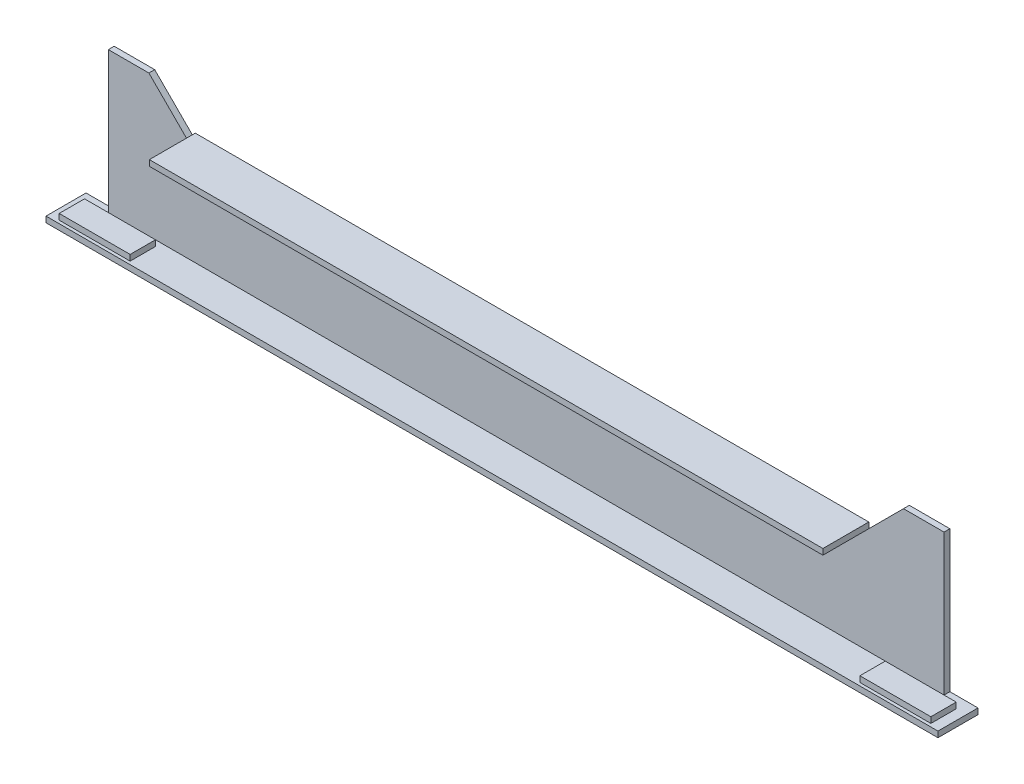
ISO-10303-21;
HEADER;
FILE_DESCRIPTION(('STEP AP214'),'2;1');
FILE_NAME('part.step','',(''),(''),'','','');
FILE_SCHEMA(('AUTOMOTIVE_DESIGN { 1 0 10303 214 1 1 1 1 }'));
ENDSEC;
DATA;
#1=APPLICATION_CONTEXT('core data for automotive mechanical design processes');
#2=APPLICATION_PROTOCOL_DEFINITION('international standard','automotive_design',2000,#1);
#3=PRODUCT_CONTEXT('',#1,'mechanical');
#4=PRODUCT('Part','Part','',(#3));
#5=PRODUCT_RELATED_PRODUCT_CATEGORY('part','',(#4));
#6=PRODUCT_DEFINITION_FORMATION('','',#4);
#7=PRODUCT_DEFINITION_CONTEXT('part definition',#1,'design');
#8=PRODUCT_DEFINITION('design','',#6,#7);
#9=PRODUCT_DEFINITION_SHAPE('','',#8);
#10=(LENGTH_UNIT() NAMED_UNIT(*) SI_UNIT(.MILLI.,.METRE.));
#11=(NAMED_UNIT(*) PLANE_ANGLE_UNIT() SI_UNIT($,.RADIAN.));
#12=(NAMED_UNIT(*) SI_UNIT($,.STERADIAN.) SOLID_ANGLE_UNIT());
#13=UNCERTAINTY_MEASURE_WITH_UNIT(LENGTH_MEASURE(1.E-05),#10,'distance_accuracy_value','');
#14=(GEOMETRIC_REPRESENTATION_CONTEXT(3) GLOBAL_UNCERTAINTY_ASSIGNED_CONTEXT((#13)) GLOBAL_UNIT_ASSIGNED_CONTEXT((#10,
#11,#12)) REPRESENTATION_CONTEXT('',''));
#15=CARTESIAN_POINT('',(0.,0.,0.));
#16=DIRECTION('',(0.,0.,1.));
#17=DIRECTION('',(1.,0.,0.));
#18=AXIS2_PLACEMENT_3D('',#15,#16,#17);
#19=CARTESIAN_POINT('',(880.,-139.25,79.));
#20=DIRECTION('',(0.,-1.,0.));
#21=DIRECTION('',(1.,0.,0.));
#22=AXIS2_PLACEMENT_3D('',#19,#20,#21);
#23=PLANE('',#22);
#24=DIRECTION('',(0.,0.,1.));
#25=VECTOR('',#24,1.);
#26=CARTESIAN_POINT('',(720.,-139.25,23.));
#27=LINE('',#26,#25);
#28=CARTESIAN_POINT('',(720.,-139.25,23.));
#29=VERTEX_POINT('',#28);
#30=CARTESIAN_POINT('',(720.,-139.25,73.));
#31=VERTEX_POINT('',#30);
#32=EDGE_CURVE('E212',#29,#31,#27,.T.);
#33=ORIENTED_EDGE('',*,*,#32,.F.);
#34=DIRECTION('',(-1.,0.,0.));
#35=VECTOR('',#34,1.);
#36=CARTESIAN_POINT('',(720.,-139.25,23.));
#37=LINE('',#36,#35);
#38=CARTESIAN_POINT('',(860.,-139.25,23.));
#39=VERTEX_POINT('',#38);
#40=EDGE_CURVE('E225',#39,#29,#37,.T.);
#41=ORIENTED_EDGE('',*,*,#40,.F.);
#42=DIRECTION('',(0.,0.,-1.));
#43=VECTOR('',#42,1.);
#44=CARTESIAN_POINT('',(860.,-139.25,23.));
#45=LINE('',#44,#43);
#46=CARTESIAN_POINT('',(860.,-139.25,73.));
#47=VERTEX_POINT('',#46);
#48=EDGE_CURVE('E234',#47,#39,#45,.T.);
#49=ORIENTED_EDGE('',*,*,#48,.F.);
#50=DIRECTION('',(1.,0.,0.));
#51=VECTOR('',#50,1.);
#52=CARTESIAN_POINT('',(720.,-139.25,73.));
#53=LINE('',#52,#51);
#54=EDGE_CURVE('E215',#31,#47,#53,.T.);
#55=ORIENTED_EDGE('',*,*,#54,.F.);
#56=EDGE_LOOP('',(#33,#41,#49,#55));
#57=FACE_BOUND('',#56,.T.);
#58=DIRECTION('',(0.,0.,-1.));
#59=VECTOR('',#58,1.);
#60=CARTESIAN_POINT('',(824.5,-139.25,11.5));
#61=LINE('',#60,#59);
#62=CARTESIAN_POINT('',(824.5,-139.25,11.5));
#63=VERTEX_POINT('',#62);
#64=CARTESIAN_POINT('',(824.5,-139.25,0.));
#65=VERTEX_POINT('',#64);
#66=EDGE_CURVE('E43',#63,#65,#61,.T.);
#67=ORIENTED_EDGE('',*,*,#66,.F.);
#68=DIRECTION('',(1.,0.,0.));
#69=VECTOR('',#68,1.);
#70=CARTESIAN_POINT('',(-824.5,-139.25,11.5));
#71=LINE('',#70,#69);
#72=CARTESIAN_POINT('',(-824.5,-139.25,11.5));
#73=VERTEX_POINT('',#72);
#74=EDGE_CURVE('E376',#73,#63,#71,.T.);
#75=ORIENTED_EDGE('',*,*,#74,.F.);
#76=DIRECTION('',(0.,0.,-1.));
#77=VECTOR('',#76,1.);
#78=CARTESIAN_POINT('',(-824.5,-139.25,11.5));
#79=LINE('',#78,#77);
#80=CARTESIAN_POINT('',(-824.5,-139.25,0.));
#81=VERTEX_POINT('',#80);
#82=EDGE_CURVE('E11',#73,#81,#79,.T.);
#83=ORIENTED_EDGE('',*,*,#82,.T.);
#84=DIRECTION('',(-1.,0.,0.));
#85=VECTOR('',#84,1.);
#86=CARTESIAN_POINT('',(880.,-139.25,0.));
#87=LINE('',#86,#85);
#88=CARTESIAN_POINT('',(-880.,-139.25,0.));
#89=VERTEX_POINT('',#88);
#90=EDGE_CURVE('E253',#81,#89,#87,.T.);
#91=ORIENTED_EDGE('',*,*,#90,.T.);
#92=DIRECTION('',(0.,0.,-1.));
#93=VECTOR('',#92,1.);
#94=CARTESIAN_POINT('',(-880.,-139.25,79.));
#95=LINE('',#94,#93);
#96=CARTESIAN_POINT('',(-880.,-139.25,79.));
#97=VERTEX_POINT('',#96);
#98=EDGE_CURVE('E268',#97,#89,#95,.T.);
#99=ORIENTED_EDGE('',*,*,#98,.F.);
#100=DIRECTION('',(-1.,0.,0.));
#101=VECTOR('',#100,1.);
#102=CARTESIAN_POINT('',(880.,-139.25,79.));
#103=LINE('',#102,#101);
#104=CARTESIAN_POINT('',(880.,-139.25,79.));
#105=VERTEX_POINT('',#104);
#106=EDGE_CURVE('E279',#105,#97,#103,.T.);
#107=ORIENTED_EDGE('',*,*,#106,.F.);
#108=DIRECTION('',(0.,0.,-1.));
#109=VECTOR('',#108,1.);
#110=CARTESIAN_POINT('',(880.,-139.25,79.));
#111=LINE('',#110,#109);
#112=CARTESIAN_POINT('',(880.,-139.25,0.));
#113=VERTEX_POINT('',#112);
#114=EDGE_CURVE('E265',#105,#113,#111,.T.);
#115=ORIENTED_EDGE('',*,*,#114,.T.);
#116=EDGE_CURVE('E262',#113,#65,#87,.T.);
#117=ORIENTED_EDGE('',*,*,#116,.T.);
#118=EDGE_LOOP('',(#67,#75,#83,#91,#99,#107,#115,#117));
#119=FACE_BOUND('',#118,.T.);
#120=DIRECTION('',(0.,0.,-1.));
#121=VECTOR('',#120,1.);
#122=CARTESIAN_POINT('',(-720.,-139.25,23.));
#123=LINE('',#122,#121);
#124=CARTESIAN_POINT('',(-720.,-139.25,73.));
#125=VERTEX_POINT('',#124);
#126=CARTESIAN_POINT('',(-720.,-139.25,23.));
#127=VERTEX_POINT('',#126);
#128=EDGE_CURVE('E211',#125,#127,#123,.T.);
#129=ORIENTED_EDGE('',*,*,#128,.F.);
#130=DIRECTION('',(1.,0.,0.));
#131=VECTOR('',#130,1.);
#132=CARTESIAN_POINT('',(-720.,-139.25,73.));
#133=LINE('',#132,#131);
#134=CARTESIAN_POINT('',(-860.,-139.25,73.));
#135=VERTEX_POINT('',#134);
#136=EDGE_CURVE('E208',#135,#125,#133,.T.);
#137=ORIENTED_EDGE('',*,*,#136,.F.);
#138=DIRECTION('',(0.,0.,1.));
#139=VECTOR('',#138,1.);
#140=CARTESIAN_POINT('',(-860.,-139.25,23.));
#141=LINE('',#140,#139);
#142=CARTESIAN_POINT('',(-860.,-139.25,23.));
#143=VERTEX_POINT('',#142);
#144=EDGE_CURVE('E56',#143,#135,#141,.T.);
#145=ORIENTED_EDGE('',*,*,#144,.F.);
#146=DIRECTION('',(-1.,0.,0.));
#147=VECTOR('',#146,1.);
#148=CARTESIAN_POINT('',(-720.,-139.25,23.));
#149=LINE('',#148,#147);
#150=EDGE_CURVE('E51',#127,#143,#149,.T.);
#151=ORIENTED_EDGE('',*,*,#150,.F.);
#152=EDGE_LOOP('',(#129,#137,#145,#151));
#153=FACE_BOUND('',#152,.T.);
#154=ADVANCED_FACE('F34',(#57,#119,#153),#23,.F.);
#155=CARTESIAN_POINT('',(-824.5,139.25,11.5));
#156=DIRECTION('',(1.,0.,0.));
#157=DIRECTION('',(0.,0.,-1.));
#158=AXIS2_PLACEMENT_3D('',#155,#156,#157);
#159=PLANE('',#158);
#160=DIRECTION('',(0.,-1.,0.));
#161=VECTOR('',#160,1.);
#162=CARTESIAN_POINT('',(-824.5,139.25,0.));
#163=LINE('',#162,#161);
#164=CARTESIAN_POINT('',(-824.5,139.25,0.));
#165=VERTEX_POINT('',#164);
#166=EDGE_CURVE('E315',#165,#81,#163,.T.);
#167=ORIENTED_EDGE('',*,*,#166,.T.);
#168=ORIENTED_EDGE('',*,*,#82,.F.);
#169=DIRECTION('',(0.,-1.,0.));
#170=VECTOR('',#169,1.);
#171=CARTESIAN_POINT('',(-824.5,139.25,11.5));
#172=LINE('',#171,#170);
#173=CARTESIAN_POINT('',(-824.5,139.25,11.5));
#174=VERTEX_POINT('',#173);
#175=EDGE_CURVE('E359',#174,#73,#172,.T.);
#176=ORIENTED_EDGE('',*,*,#175,.F.);
#177=DIRECTION('',(0.,0.,-1.));
#178=VECTOR('',#177,1.);
#179=CARTESIAN_POINT('',(-824.5,139.25,11.5));
#180=LINE('',#179,#178);
#181=EDGE_CURVE('E355',#174,#165,#180,.T.);
#182=ORIENTED_EDGE('',*,*,#181,.T.);
#183=EDGE_LOOP('',(#167,#168,#176,#182));
#184=FACE_BOUND('',#183,.T.);
#185=ADVANCED_FACE('F36',(#184),#159,.F.);
#186=CARTESIAN_POINT('',(824.5,139.25,11.5));
#187=DIRECTION('',(-1.,0.,0.));
#188=DIRECTION('',(0.,0.,1.));
#189=AXIS2_PLACEMENT_3D('',#186,#187,#188);
#190=PLANE('',#189);
#191=DIRECTION('',(0.,1.,0.));
#192=VECTOR('',#191,1.);
#193=CARTESIAN_POINT('',(824.5,139.25,0.));
#194=LINE('',#193,#192);
#195=CARTESIAN_POINT('',(824.5,139.25,0.));
#196=VERTEX_POINT('',#195);
#197=EDGE_CURVE('E319',#65,#196,#194,.T.);
#198=ORIENTED_EDGE('',*,*,#197,.T.);
#199=DIRECTION('',(0.,0.,-1.));
#200=VECTOR('',#199,1.);
#201=CARTESIAN_POINT('',(824.5,139.25,11.5));
#202=LINE('',#201,#200);
#203=CARTESIAN_POINT('',(824.5,139.25,11.5));
#204=VERTEX_POINT('',#203);
#205=EDGE_CURVE('E333',#204,#196,#202,.T.);
#206=ORIENTED_EDGE('',*,*,#205,.F.);
#207=DIRECTION('',(0.,1.,0.));
#208=VECTOR('',#207,1.);
#209=CARTESIAN_POINT('',(824.5,139.25,11.5));
#210=LINE('',#209,#208);
#211=EDGE_CURVE('E374',#63,#204,#210,.T.);
#212=ORIENTED_EDGE('',*,*,#211,.F.);
#213=ORIENTED_EDGE('',*,*,#66,.T.);
#214=EDGE_LOOP('',(#198,#206,#212,#213));
#215=FACE_BOUND('',#214,.T.);
#216=ADVANCED_FACE('F426',(#215),#190,.F.);
#217=CARTESIAN_POINT('',(744.5,139.25,11.5));
#218=DIRECTION('',(0.,-1.,0.));
#219=DIRECTION('',(1.,0.,0.));
#220=AXIS2_PLACEMENT_3D('',#217,#218,#219);
#221=PLANE('',#220);
#222=DIRECTION('',(-1.,0.,0.));
#223=VECTOR('',#222,1.);
#224=CARTESIAN_POINT('',(744.5,139.25,0.));
#225=LINE('',#224,#223);
#226=CARTESIAN_POINT('',(744.5,139.25,0.));
#227=VERTEX_POINT('',#226);
#228=EDGE_CURVE('E322',#196,#227,#225,.T.);
#229=ORIENTED_EDGE('',*,*,#228,.T.);
#230=DIRECTION('',(0.,0.,-1.));
#231=VECTOR('',#230,1.);
#232=CARTESIAN_POINT('',(744.5,139.25,11.5));
#233=LINE('',#232,#231);
#234=CARTESIAN_POINT('',(744.5,139.25,11.5));
#235=VERTEX_POINT('',#234);
#236=EDGE_CURVE('E338',#235,#227,#233,.T.);
#237=ORIENTED_EDGE('',*,*,#236,.F.);
#238=DIRECTION('',(-1.,0.,0.));
#239=VECTOR('',#238,1.);
#240=CARTESIAN_POINT('',(744.5,139.25,11.5));
#241=LINE('',#240,#239);
#242=EDGE_CURVE('E372',#204,#235,#241,.T.);
#243=ORIENTED_EDGE('',*,*,#242,.F.);
#244=ORIENTED_EDGE('',*,*,#205,.T.);
#245=EDGE_LOOP('',(#229,#237,#243,#244));
#246=FACE_BOUND('',#245,.T.);
#247=ADVANCED_FACE('F423',(#246),#221,.F.);
#248=CARTESIAN_POINT('',(744.5,139.25,11.5));
#249=DIRECTION('',(0.707106781186549,-0.707106781186546,0.));
#250=DIRECTION('',(0.707106781186546,0.707106781186549,0.));
#251=AXIS2_PLACEMENT_3D('',#248,#249,#250);
#252=PLANE('',#251);
#253=DIRECTION('',(-0.707106781186546,-0.707106781186549,0.));
#254=VECTOR('',#253,1.);
#255=CARTESIAN_POINT('',(744.5,139.25,0.));
#256=LINE('',#255,#254);
#257=CARTESIAN_POINT('',(664.5,59.2499999999996,0.));
#258=VERTEX_POINT('',#257);
#259=EDGE_CURVE('E362',#227,#258,#256,.T.);
#260=ORIENTED_EDGE('',*,*,#259,.T.);
#261=DIRECTION('',(0.,0.,-1.));
#262=VECTOR('',#261,1.);
#263=CARTESIAN_POINT('',(664.5,59.2499999999996,11.5));
#264=LINE('',#263,#262);
#265=CARTESIAN_POINT('',(664.5,59.2499999999996,11.5));
#266=VERTEX_POINT('',#265);
#267=EDGE_CURVE('E344',#266,#258,#264,.T.);
#268=ORIENTED_EDGE('',*,*,#267,.F.);
#269=DIRECTION('',(-0.707106781186546,-0.707106781186549,0.));
#270=VECTOR('',#269,1.);
#271=CARTESIAN_POINT('',(744.5,139.25,11.5));
#272=LINE('',#271,#270);
#273=EDGE_CURVE('E370',#235,#266,#272,.T.);
#274=ORIENTED_EDGE('',*,*,#273,.F.);
#275=ORIENTED_EDGE('',*,*,#236,.T.);
#276=EDGE_LOOP('',(#260,#268,#274,#275));
#277=FACE_BOUND('',#276,.T.);
#278=ADVANCED_FACE('F419',(#277),#252,.F.);
#279=CARTESIAN_POINT('',(-744.5,139.25,11.5));
#280=DIRECTION('',(-0.707106781186548,-0.707106781186547,0.));
#281=DIRECTION('',(0.707106781186547,-0.707106781186548,0.));
#282=AXIS2_PLACEMENT_3D('',#279,#280,#281);
#283=PLANE('',#282);
#284=DIRECTION('',(-0.707106781186547,0.707106781186548,0.));
#285=VECTOR('',#284,1.);
#286=CARTESIAN_POINT('',(-744.5,139.25,0.));
#287=LINE('',#286,#285);
#288=CARTESIAN_POINT('',(-664.5,59.2499999999996,0.));
#289=VERTEX_POINT('',#288);
#290=CARTESIAN_POINT('',(-744.5,139.25,0.));
#291=VERTEX_POINT('',#290);
#292=EDGE_CURVE('E360',#289,#291,#287,.T.);
#293=ORIENTED_EDGE('',*,*,#292,.T.);
#294=DIRECTION('',(0.,0.,-1.));
#295=VECTOR('',#294,1.);
#296=CARTESIAN_POINT('',(-744.5,139.25,11.5));
#297=LINE('',#296,#295);
#298=CARTESIAN_POINT('',(-744.5,139.25,11.5));
#299=VERTEX_POINT('',#298);
#300=EDGE_CURVE('E352',#299,#291,#297,.T.);
#301=ORIENTED_EDGE('',*,*,#300,.F.);
#302=DIRECTION('',(-0.707106781186547,0.707106781186548,0.));
#303=VECTOR('',#302,1.);
#304=CARTESIAN_POINT('',(-744.5,139.25,11.5));
#305=LINE('',#304,#303);
#306=CARTESIAN_POINT('',(-664.5,59.2499999999996,11.5));
#307=VERTEX_POINT('',#306);
#308=EDGE_CURVE('E366',#307,#299,#305,.T.);
#309=ORIENTED_EDGE('',*,*,#308,.F.);
#310=DIRECTION('',(0.,0.,-1.));
#311=VECTOR('',#310,1.);
#312=CARTESIAN_POINT('',(-664.5,59.2499999999996,11.5));
#313=LINE('',#312,#311);
#314=EDGE_CURVE('E349',#307,#289,#313,.T.);
#315=ORIENTED_EDGE('',*,*,#314,.T.);
#316=EDGE_LOOP('',(#293,#301,#309,#315));
#317=FACE_BOUND('',#316,.T.);
#318=ADVANCED_FACE('F464',(#317),#283,.F.);
#319=CARTESIAN_POINT('',(-824.5,139.25,11.5));
#320=DIRECTION('',(0.,-1.,0.));
#321=DIRECTION('',(1.,0.,0.));
#322=AXIS2_PLACEMENT_3D('',#319,#320,#321);
#323=PLANE('',#322);
#324=DIRECTION('',(-1.,0.,0.));
#325=VECTOR('',#324,1.);
#326=CARTESIAN_POINT('',(-824.5,139.25,0.));
#327=LINE('',#326,#325);
#328=EDGE_CURVE('E316',#291,#165,#327,.T.);
#329=ORIENTED_EDGE('',*,*,#328,.T.);
#330=ORIENTED_EDGE('',*,*,#181,.F.);
#331=DIRECTION('',(-1.,0.,0.));
#332=VECTOR('',#331,1.);
#333=CARTESIAN_POINT('',(-824.5,139.25,11.5));
#334=LINE('',#333,#332);
#335=EDGE_CURVE('E357',#299,#174,#334,.T.);
#336=ORIENTED_EDGE('',*,*,#335,.F.);
#337=ORIENTED_EDGE('',*,*,#300,.T.);
#338=EDGE_LOOP('',(#329,#330,#336,#337));
#339=FACE_BOUND('',#338,.T.);
#340=ADVANCED_FACE('F459',(#339),#323,.F.);
#341=CARTESIAN_POINT('',(-824.5,59.2499999999996,11.5));
#342=DIRECTION('',(0.,0.,1.));
#343=DIRECTION('',(1.,0.,0.));
#344=AXIS2_PLACEMENT_3D('',#341,#342,#343);
#345=PLANE('',#344);
#346=ORIENTED_EDGE('',*,*,#175,.T.);
#347=ORIENTED_EDGE('',*,*,#74,.T.);
#348=ORIENTED_EDGE('',*,*,#211,.T.);
#349=ORIENTED_EDGE('',*,*,#242,.T.);
#350=ORIENTED_EDGE('',*,*,#273,.T.);
#351=DIRECTION('',(-1.,0.,0.));
#352=VECTOR('',#351,1.);
#353=CARTESIAN_POINT('',(-664.5,59.2499999999996,11.5));
#354=LINE('',#353,#352);
#355=EDGE_CURVE('E368',#266,#307,#354,.T.);
#356=ORIENTED_EDGE('',*,*,#355,.T.);
#357=ORIENTED_EDGE('',*,*,#308,.T.);
#358=ORIENTED_EDGE('',*,*,#335,.T.);
#359=EDGE_LOOP('',(#346,#347,#348,#349,#350,#356,#357,#358));
#360=FACE_BOUND('',#359,.T.);
#361=ADVANCED_FACE('F425',(#360),#345,.T.);
#362=CARTESIAN_POINT('',(-824.5,59.2499999999996,0.));
#363=DIRECTION('',(0.,0.,1.));
#364=DIRECTION('',(1.,0.,0.));
#365=AXIS2_PLACEMENT_3D('',#362,#363,#364);
#366=PLANE('',#365);
#367=ORIENTED_EDGE('',*,*,#166,.F.);
#368=ORIENTED_EDGE('',*,*,#328,.F.);
#369=ORIENTED_EDGE('',*,*,#292,.F.);
#370=DIRECTION('',(0.,-1.,0.));
#371=VECTOR('',#370,1.);
#372=CARTESIAN_POINT('',(-664.5,59.2499999999996,0.));
#373=LINE('',#372,#371);
#374=CARTESIAN_POINT('',(-664.5,70.7499999999995,0.));
#375=VERTEX_POINT('',#374);
#376=EDGE_CURVE('E267',#375,#289,#373,.T.);
#377=ORIENTED_EDGE('',*,*,#376,.F.);
#378=DIRECTION('',(-1.,0.,0.));
#379=VECTOR('',#378,1.);
#380=CARTESIAN_POINT('',(-664.5,70.7499999999995,0.));
#381=LINE('',#380,#379);
#382=CARTESIAN_POINT('',(664.5,70.7499999999995,0.));
#383=VERTEX_POINT('',#382);
#384=EDGE_CURVE('E394',#383,#375,#381,.T.);
#385=ORIENTED_EDGE('',*,*,#384,.F.);
#386=DIRECTION('',(0.,1.,0.));
#387=VECTOR('',#386,1.);
#388=CARTESIAN_POINT('',(664.5,59.2499999999996,0.));
#389=LINE('',#388,#387);
#390=EDGE_CURVE('E397',#258,#383,#389,.T.);
#391=ORIENTED_EDGE('',*,*,#390,.F.);
#392=ORIENTED_EDGE('',*,*,#259,.F.);
#393=ORIENTED_EDGE('',*,*,#228,.F.);
#394=ORIENTED_EDGE('',*,*,#197,.F.);
#395=ORIENTED_EDGE('',*,*,#116,.F.);
#396=DIRECTION('',(0.,1.,0.));
#397=VECTOR('',#396,1.);
#398=CARTESIAN_POINT('',(880.,-139.25,0.));
#399=LINE('',#398,#397);
#400=CARTESIAN_POINT('',(880.,-150.75,0.));
#401=VERTEX_POINT('',#400);
#402=EDGE_CURVE('E250',#401,#113,#399,.T.);
#403=ORIENTED_EDGE('',*,*,#402,.F.);
#404=DIRECTION('',(1.,0.,0.));
#405=VECTOR('',#404,1.);
#406=CARTESIAN_POINT('',(880.,-150.75,0.));
#407=LINE('',#406,#405);
#408=CARTESIAN_POINT('',(-880.,-150.75,0.));
#409=VERTEX_POINT('',#408);
#410=EDGE_CURVE('E283',#409,#401,#407,.T.);
#411=ORIENTED_EDGE('',*,*,#410,.F.);
#412=DIRECTION('',(0.,-1.,0.));
#413=VECTOR('',#412,1.);
#414=CARTESIAN_POINT('',(-880.,-139.25,0.));
#415=LINE('',#414,#413);
#416=EDGE_CURVE('E256',#89,#409,#415,.T.);
#417=ORIENTED_EDGE('',*,*,#416,.F.);
#418=ORIENTED_EDGE('',*,*,#90,.F.);
#419=EDGE_LOOP('',(#367,#368,#369,#377,#385,#391,#392,#393,#394,#395,#403,#411,#417,#418));
#420=FACE_BOUND('',#419,.T.);
#421=ADVANCED_FACE('F300',(#420),#366,.F.);
#422=CARTESIAN_POINT('',(-664.5,59.2499999999996,90.5));
#423=DIRECTION('',(1.,0.,0.));
#424=DIRECTION('',(0.,0.,-1.));
#425=AXIS2_PLACEMENT_3D('',#422,#423,#424);
#426=PLANE('',#425);
#427=DIRECTION('',(0.,0.,-1.));
#428=VECTOR('',#427,1.);
#429=CARTESIAN_POINT('',(-664.5,70.7499999999995,90.5));
#430=LINE('',#429,#428);
#431=CARTESIAN_POINT('',(-664.5,70.7499999999995,90.5));
#432=VERTEX_POINT('',#431);
#433=EDGE_CURVE('E383',#432,#375,#430,.T.);
#434=ORIENTED_EDGE('',*,*,#433,.T.);
#435=ORIENTED_EDGE('',*,*,#376,.T.);
#436=ORIENTED_EDGE('',*,*,#314,.F.);
#437=DIRECTION('',(0.,0.,-1.));
#438=VECTOR('',#437,1.);
#439=CARTESIAN_POINT('',(-664.5,59.2499999999996,90.5));
#440=LINE('',#439,#438);
#441=CARTESIAN_POINT('',(-664.5,59.2499999999996,90.5));
#442=VERTEX_POINT('',#441);
#443=EDGE_CURVE('E320',#442,#307,#440,.T.);
#444=ORIENTED_EDGE('',*,*,#443,.F.);
#445=DIRECTION('',(0.,-1.,0.));
#446=VECTOR('',#445,1.);
#447=CARTESIAN_POINT('',(-664.5,59.2499999999996,90.5));
#448=LINE('',#447,#446);
#449=EDGE_CURVE('E391',#432,#442,#448,.T.);
#450=ORIENTED_EDGE('',*,*,#449,.F.);
#451=EDGE_LOOP('',(#434,#435,#436,#444,#450));
#452=FACE_BOUND('',#451,.T.);
#453=ADVANCED_FACE('F403',(#452),#426,.F.);
#454=CARTESIAN_POINT('',(-664.5,59.2499999999996,90.5));
#455=DIRECTION('',(0.,1.,0.));
#456=DIRECTION('',(0.,0.,1.));
#457=AXIS2_PLACEMENT_3D('',#454,#455,#456);
#458=PLANE('',#457);
#459=ORIENTED_EDGE('',*,*,#355,.F.);
#460=DIRECTION('',(0.,0.,-1.));
#461=VECTOR('',#460,1.);
#462=CARTESIAN_POINT('',(664.5,59.2499999999996,90.5));
#463=LINE('',#462,#461);
#464=CARTESIAN_POINT('',(664.5,59.2499999999996,90.5));
#465=VERTEX_POINT('',#464);
#466=EDGE_CURVE('E324',#465,#266,#463,.T.);
#467=ORIENTED_EDGE('',*,*,#466,.F.);
#468=DIRECTION('',(1.,0.,0.));
#469=VECTOR('',#468,1.);
#470=CARTESIAN_POINT('',(-664.5,59.2499999999996,90.5));
#471=LINE('',#470,#469);
#472=EDGE_CURVE('E389',#442,#465,#471,.T.);
#473=ORIENTED_EDGE('',*,*,#472,.F.);
#474=ORIENTED_EDGE('',*,*,#443,.T.);
#475=EDGE_LOOP('',(#459,#467,#473,#474));
#476=FACE_BOUND('',#475,.T.);
#477=ADVANCED_FACE('F451',(#476),#458,.F.);
#478=CARTESIAN_POINT('',(664.5,59.2499999999996,90.5));
#479=DIRECTION('',(-1.,0.,0.));
#480=DIRECTION('',(0.,0.,1.));
#481=AXIS2_PLACEMENT_3D('',#478,#479,#480);
#482=PLANE('',#481);
#483=ORIENTED_EDGE('',*,*,#466,.T.);
#484=ORIENTED_EDGE('',*,*,#267,.T.);
#485=ORIENTED_EDGE('',*,*,#390,.T.);
#486=DIRECTION('',(0.,0.,-1.));
#487=VECTOR('',#486,1.);
#488=CARTESIAN_POINT('',(664.5,70.7499999999995,90.5));
#489=LINE('',#488,#487);
#490=CARTESIAN_POINT('',(664.5,70.7499999999995,90.5));
#491=VERTEX_POINT('',#490);
#492=EDGE_CURVE('E381',#491,#383,#489,.T.);
#493=ORIENTED_EDGE('',*,*,#492,.F.);
#494=DIRECTION('',(0.,1.,0.));
#495=VECTOR('',#494,1.);
#496=CARTESIAN_POINT('',(664.5,59.2499999999996,90.5));
#497=LINE('',#496,#495);
#498=EDGE_CURVE('E387',#465,#491,#497,.T.);
#499=ORIENTED_EDGE('',*,*,#498,.F.);
#500=EDGE_LOOP('',(#483,#484,#485,#493,#499));
#501=FACE_BOUND('',#500,.T.);
#502=ADVANCED_FACE('F415',(#501),#482,.F.);
#503=CARTESIAN_POINT('',(-664.5,70.7499999999995,90.5));
#504=DIRECTION('',(0.,-1.,0.));
#505=DIRECTION('',(0.,0.,-1.));
#506=AXIS2_PLACEMENT_3D('',#503,#504,#505);
#507=PLANE('',#506);
#508=ORIENTED_EDGE('',*,*,#492,.T.);
#509=ORIENTED_EDGE('',*,*,#384,.T.);
#510=ORIENTED_EDGE('',*,*,#433,.F.);
#511=DIRECTION('',(-1.,0.,0.));
#512=VECTOR('',#511,1.);
#513=CARTESIAN_POINT('',(-664.5,70.7499999999995,90.5));
#514=LINE('',#513,#512);
#515=EDGE_CURVE('E385',#491,#432,#514,.T.);
#516=ORIENTED_EDGE('',*,*,#515,.F.);
#517=EDGE_LOOP('',(#508,#509,#510,#516));
#518=FACE_BOUND('',#517,.T.);
#519=ADVANCED_FACE('F410',(#518),#507,.F.);
#520=CARTESIAN_POINT('',(-664.5,70.7499999999995,90.5));
#521=DIRECTION('',(0.,0.,-1.));
#522=DIRECTION('',(-1.,0.,0.));
#523=AXIS2_PLACEMENT_3D('',#520,#521,#522);
#524=PLANE('',#523);
#525=ORIENTED_EDGE('',*,*,#449,.T.);
#526=ORIENTED_EDGE('',*,*,#472,.T.);
#527=ORIENTED_EDGE('',*,*,#498,.T.);
#528=ORIENTED_EDGE('',*,*,#515,.T.);
#529=EDGE_LOOP('',(#525,#526,#527,#528));
#530=FACE_BOUND('',#529,.T.);
#531=ADVANCED_FACE('F443',(#530),#524,.F.);
#532=CARTESIAN_POINT('',(880.,-139.25,79.));
#533=DIRECTION('',(-1.,0.,0.));
#534=DIRECTION('',(0.,-1.,0.));
#535=AXIS2_PLACEMENT_3D('',#532,#533,#534);
#536=PLANE('',#535);
#537=DIRECTION('',(0.,0.,-1.));
#538=VECTOR('',#537,1.);
#539=CARTESIAN_POINT('',(880.,-150.75,79.));
#540=LINE('',#539,#538);
#541=CARTESIAN_POINT('',(880.,-150.75,79.));
#542=VERTEX_POINT('',#541);
#543=EDGE_CURVE('E273',#542,#401,#540,.T.);
#544=ORIENTED_EDGE('',*,*,#543,.T.);
#545=ORIENTED_EDGE('',*,*,#402,.T.);
#546=ORIENTED_EDGE('',*,*,#114,.F.);
#547=DIRECTION('',(0.,1.,0.));
#548=VECTOR('',#547,1.);
#549=CARTESIAN_POINT('',(880.,-139.25,79.));
#550=LINE('',#549,#548);
#551=EDGE_CURVE('E281',#542,#105,#550,.T.);
#552=ORIENTED_EDGE('',*,*,#551,.F.);
#553=EDGE_LOOP('',(#544,#545,#546,#552));
#554=FACE_BOUND('',#553,.T.);
#555=ADVANCED_FACE('F305',(#554),#536,.F.);
#556=CARTESIAN_POINT('',(-880.,-139.25,79.));
#557=DIRECTION('',(1.,0.,0.));
#558=DIRECTION('',(0.,1.,0.));
#559=AXIS2_PLACEMENT_3D('',#556,#557,#558);
#560=PLANE('',#559);
#561=ORIENTED_EDGE('',*,*,#98,.T.);
#562=ORIENTED_EDGE('',*,*,#416,.T.);
#563=DIRECTION('',(0.,0.,-1.));
#564=VECTOR('',#563,1.);
#565=CARTESIAN_POINT('',(-880.,-150.75,79.));
#566=LINE('',#565,#564);
#567=CARTESIAN_POINT('',(-880.,-150.75,79.));
#568=VERTEX_POINT('',#567);
#569=EDGE_CURVE('E271',#568,#409,#566,.T.);
#570=ORIENTED_EDGE('',*,*,#569,.F.);
#571=DIRECTION('',(0.,-1.,0.));
#572=VECTOR('',#571,1.);
#573=CARTESIAN_POINT('',(-880.,-139.25,79.));
#574=LINE('',#573,#572);
#575=EDGE_CURVE('E277',#97,#568,#574,.T.);
#576=ORIENTED_EDGE('',*,*,#575,.F.);
#577=EDGE_LOOP('',(#561,#562,#570,#576));
#578=FACE_BOUND('',#577,.T.);
#579=ADVANCED_FACE('F292',(#578),#560,.F.);
#580=CARTESIAN_POINT('',(880.,-150.75,79.));
#581=DIRECTION('',(0.,1.,0.));
#582=DIRECTION('',(-1.,0.,0.));
#583=AXIS2_PLACEMENT_3D('',#580,#581,#582);
#584=PLANE('',#583);
#585=ORIENTED_EDGE('',*,*,#569,.T.);
#586=ORIENTED_EDGE('',*,*,#410,.T.);
#587=ORIENTED_EDGE('',*,*,#543,.F.);
#588=DIRECTION('',(1.,0.,0.));
#589=VECTOR('',#588,1.);
#590=CARTESIAN_POINT('',(880.,-150.75,79.));
#591=LINE('',#590,#589);
#592=EDGE_CURVE('E275',#568,#542,#591,.T.);
#593=ORIENTED_EDGE('',*,*,#592,.F.);
#594=EDGE_LOOP('',(#585,#586,#587,#593));
#595=FACE_BOUND('',#594,.T.);
#596=ADVANCED_FACE('F307',(#595),#584,.F.);
#597=CARTESIAN_POINT('',(880.,-150.75,79.));
#598=DIRECTION('',(0.,0.,-1.));
#599=DIRECTION('',(-1.,0.,0.));
#600=AXIS2_PLACEMENT_3D('',#597,#598,#599);
#601=PLANE('',#600);
#602=ORIENTED_EDGE('',*,*,#551,.T.);
#603=ORIENTED_EDGE('',*,*,#106,.T.);
#604=ORIENTED_EDGE('',*,*,#575,.T.);
#605=ORIENTED_EDGE('',*,*,#592,.T.);
#606=EDGE_LOOP('',(#602,#603,#604,#605));
#607=FACE_BOUND('',#606,.T.);
#608=ADVANCED_FACE('F309',(#607),#601,.F.);
#609=CARTESIAN_POINT('',(720.,-127.75,23.));
#610=DIRECTION('',(1.,0.,0.));
#611=DIRECTION('',(0.,1.,0.));
#612=AXIS2_PLACEMENT_3D('',#609,#610,#611);
#613=PLANE('',#612);
#614=ORIENTED_EDGE('',*,*,#32,.T.);
#615=DIRECTION('',(0.,-1.,0.));
#616=VECTOR('',#615,1.);
#617=CARTESIAN_POINT('',(720.,-127.75,73.));
#618=LINE('',#617,#616);
#619=CARTESIAN_POINT('',(720.,-127.75,73.));
#620=VERTEX_POINT('',#619);
#621=EDGE_CURVE('E247',#620,#31,#618,.T.);
#622=ORIENTED_EDGE('',*,*,#621,.F.);
#623=DIRECTION('',(0.,0.,1.));
#624=VECTOR('',#623,1.);
#625=CARTESIAN_POINT('',(720.,-127.75,23.));
#626=LINE('',#625,#624);
#627=CARTESIAN_POINT('',(720.,-127.75,23.));
#628=VERTEX_POINT('',#627);
#629=EDGE_CURVE('E221',#628,#620,#626,.T.);
#630=ORIENTED_EDGE('',*,*,#629,.F.);
#631=DIRECTION('',(0.,-1.,0.));
#632=VECTOR('',#631,1.);
#633=CARTESIAN_POINT('',(720.,-127.75,23.));
#634=LINE('',#633,#632);
#635=EDGE_CURVE('E230',#628,#29,#634,.T.);
#636=ORIENTED_EDGE('',*,*,#635,.T.);
#637=EDGE_LOOP('',(#614,#622,#630,#636));
#638=FACE_BOUND('',#637,.T.);
#639=ADVANCED_FACE('F531',(#638),#613,.F.);
#640=CARTESIAN_POINT('',(720.,-127.75,73.));
#641=DIRECTION('',(0.,0.,-1.));
#642=DIRECTION('',(-1.,0.,0.));
#643=AXIS2_PLACEMENT_3D('',#640,#641,#642);
#644=PLANE('',#643);
#645=ORIENTED_EDGE('',*,*,#54,.T.);
#646=DIRECTION('',(0.,-1.,0.));
#647=VECTOR('',#646,1.);
#648=CARTESIAN_POINT('',(860.,-127.75,73.));
#649=LINE('',#648,#647);
#650=CARTESIAN_POINT('',(860.,-127.75,73.));
#651=VERTEX_POINT('',#650);
#652=EDGE_CURVE('E244',#651,#47,#649,.T.);
#653=ORIENTED_EDGE('',*,*,#652,.F.);
#654=DIRECTION('',(1.,0.,0.));
#655=VECTOR('',#654,1.);
#656=CARTESIAN_POINT('',(720.,-127.75,73.));
#657=LINE('',#656,#655);
#658=EDGE_CURVE('E224',#620,#651,#657,.T.);
#659=ORIENTED_EDGE('',*,*,#658,.F.);
#660=ORIENTED_EDGE('',*,*,#621,.T.);
#661=EDGE_LOOP('',(#645,#653,#659,#660));
#662=FACE_BOUND('',#661,.T.);
#663=ADVANCED_FACE('F538',(#662),#644,.F.);
#664=CARTESIAN_POINT('',(860.,-127.75,23.));
#665=DIRECTION('',(-1.,0.,0.));
#666=DIRECTION('',(0.,-1.,0.));
#667=AXIS2_PLACEMENT_3D('',#664,#665,#666);
#668=PLANE('',#667);
#669=ORIENTED_EDGE('',*,*,#48,.T.);
#670=DIRECTION('',(0.,-1.,0.));
#671=VECTOR('',#670,1.);
#672=CARTESIAN_POINT('',(860.,-127.75,23.));
#673=LINE('',#672,#671);
#674=CARTESIAN_POINT('',(860.,-127.75,23.));
#675=VERTEX_POINT('',#674);
#676=EDGE_CURVE('E241',#675,#39,#673,.T.);
#677=ORIENTED_EDGE('',*,*,#676,.F.);
#678=DIRECTION('',(0.,0.,-1.));
#679=VECTOR('',#678,1.);
#680=CARTESIAN_POINT('',(860.,-127.75,23.));
#681=LINE('',#680,#679);
#682=EDGE_CURVE('E227',#651,#675,#681,.T.);
#683=ORIENTED_EDGE('',*,*,#682,.F.);
#684=ORIENTED_EDGE('',*,*,#652,.T.);
#685=EDGE_LOOP('',(#669,#677,#683,#684));
#686=FACE_BOUND('',#685,.T.);
#687=ADVANCED_FACE('F546',(#686),#668,.F.);
#688=CARTESIAN_POINT('',(720.,-127.75,23.));
#689=DIRECTION('',(0.,0.,1.));
#690=DIRECTION('',(1.,0.,0.));
#691=AXIS2_PLACEMENT_3D('',#688,#689,#690);
#692=PLANE('',#691);
#693=ORIENTED_EDGE('',*,*,#40,.T.);
#694=ORIENTED_EDGE('',*,*,#635,.F.);
#695=DIRECTION('',(-1.,0.,0.));
#696=VECTOR('',#695,1.);
#697=CARTESIAN_POINT('',(720.,-127.75,23.));
#698=LINE('',#697,#696);
#699=EDGE_CURVE('E229',#675,#628,#698,.T.);
#700=ORIENTED_EDGE('',*,*,#699,.F.);
#701=ORIENTED_EDGE('',*,*,#676,.T.);
#702=EDGE_LOOP('',(#693,#694,#700,#701));
#703=FACE_BOUND('',#702,.T.);
#704=ADVANCED_FACE('F554',(#703),#692,.F.);
#705=CARTESIAN_POINT('',(720.,-127.75,23.));
#706=DIRECTION('',(0.,1.,0.));
#707=DIRECTION('',(-1.,0.,0.));
#708=AXIS2_PLACEMENT_3D('',#705,#706,#707);
#709=PLANE('',#708);
#710=ORIENTED_EDGE('',*,*,#629,.T.);
#711=ORIENTED_EDGE('',*,*,#658,.T.);
#712=ORIENTED_EDGE('',*,*,#682,.T.);
#713=ORIENTED_EDGE('',*,*,#699,.T.);
#714=EDGE_LOOP('',(#710,#711,#712,#713));
#715=FACE_BOUND('',#714,.T.);
#716=ADVANCED_FACE('F562',(#715),#709,.T.);
#717=CARTESIAN_POINT('',(-720.,-127.75,23.));
#718=DIRECTION('',(-1.,0.,0.));
#719=DIRECTION('',(0.,-1.,0.));
#720=AXIS2_PLACEMENT_3D('',#717,#718,#719);
#721=PLANE('',#720);
#722=ORIENTED_EDGE('',*,*,#128,.T.);
#723=DIRECTION('',(0.,-1.,0.));
#724=VECTOR('',#723,1.);
#725=CARTESIAN_POINT('',(-720.,-127.75,23.));
#726=LINE('',#725,#724);
#727=CARTESIAN_POINT('',(-720.,-127.75,23.));
#728=VERTEX_POINT('',#727);
#729=EDGE_CURVE('E192',#728,#127,#726,.T.);
#730=ORIENTED_EDGE('',*,*,#729,.F.);
#731=DIRECTION('',(0.,0.,-1.));
#732=VECTOR('',#731,1.);
#733=CARTESIAN_POINT('',(-720.,-127.75,23.));
#734=LINE('',#733,#732);
#735=CARTESIAN_POINT('',(-720.,-127.75,73.));
#736=VERTEX_POINT('',#735);
#737=EDGE_CURVE('E199',#736,#728,#734,.T.);
#738=ORIENTED_EDGE('',*,*,#737,.F.);
#739=DIRECTION('',(0.,-1.,0.));
#740=VECTOR('',#739,1.);
#741=CARTESIAN_POINT('',(-720.,-127.75,73.));
#742=LINE('',#741,#740);
#743=EDGE_CURVE('E680',#736,#125,#742,.T.);
#744=ORIENTED_EDGE('',*,*,#743,.T.);
#745=EDGE_LOOP('',(#722,#730,#738,#744));
#746=FACE_BOUND('',#745,.T.);
#747=ADVANCED_FACE('F210',(#746),#721,.F.);
#748=CARTESIAN_POINT('',(-720.,-127.75,23.));
#749=DIRECTION('',(0.,0.,1.));
#750=DIRECTION('',(1.,0.,0.));
#751=AXIS2_PLACEMENT_3D('',#748,#749,#750);
#752=PLANE('',#751);
#753=ORIENTED_EDGE('',*,*,#150,.T.);
#754=DIRECTION('',(0.,-1.,0.));
#755=VECTOR('',#754,1.);
#756=CARTESIAN_POINT('',(-860.,-127.75,23.));
#757=LINE('',#756,#755);
#758=CARTESIAN_POINT('',(-860.,-127.75,23.));
#759=VERTEX_POINT('',#758);
#760=EDGE_CURVE('E195',#759,#143,#757,.T.);
#761=ORIENTED_EDGE('',*,*,#760,.F.);
#762=DIRECTION('',(-1.,0.,0.));
#763=VECTOR('',#762,1.);
#764=CARTESIAN_POINT('',(-720.,-127.75,23.));
#765=LINE('',#764,#763);
#766=EDGE_CURVE('E188',#728,#759,#765,.T.);
#767=ORIENTED_EDGE('',*,*,#766,.F.);
#768=ORIENTED_EDGE('',*,*,#729,.T.);
#769=EDGE_LOOP('',(#753,#761,#767,#768));
#770=FACE_BOUND('',#769,.T.);
#771=ADVANCED_FACE('F190',(#770),#752,.F.);
#772=CARTESIAN_POINT('',(-860.,-127.75,23.));
#773=DIRECTION('',(1.,0.,0.));
#774=DIRECTION('',(0.,1.,0.));
#775=AXIS2_PLACEMENT_3D('',#772,#773,#774);
#776=PLANE('',#775);
#777=ORIENTED_EDGE('',*,*,#144,.T.);
#778=DIRECTION('',(0.,-1.,0.));
#779=VECTOR('',#778,1.);
#780=CARTESIAN_POINT('',(-860.,-127.75,73.));
#781=LINE('',#780,#779);
#782=CARTESIAN_POINT('',(-860.,-127.75,73.));
#783=VERTEX_POINT('',#782);
#784=EDGE_CURVE('E217',#783,#135,#781,.T.);
#785=ORIENTED_EDGE('',*,*,#784,.F.);
#786=DIRECTION('',(0.,0.,1.));
#787=VECTOR('',#786,1.);
#788=CARTESIAN_POINT('',(-860.,-127.75,23.));
#789=LINE('',#788,#787);
#790=EDGE_CURVE('E198',#759,#783,#789,.T.);
#791=ORIENTED_EDGE('',*,*,#790,.F.);
#792=ORIENTED_EDGE('',*,*,#760,.T.);
#793=EDGE_LOOP('',(#777,#785,#791,#792));
#794=FACE_BOUND('',#793,.T.);
#795=ADVANCED_FACE('F583',(#794),#776,.F.);
#796=CARTESIAN_POINT('',(-720.,-127.75,73.));
#797=DIRECTION('',(0.,0.,-1.));
#798=DIRECTION('',(-1.,0.,0.));
#799=AXIS2_PLACEMENT_3D('',#796,#797,#798);
#800=PLANE('',#799);
#801=ORIENTED_EDGE('',*,*,#136,.T.);
#802=ORIENTED_EDGE('',*,*,#743,.F.);
#803=DIRECTION('',(1.,0.,0.));
#804=VECTOR('',#803,1.);
#805=CARTESIAN_POINT('',(-720.,-127.75,73.));
#806=LINE('',#805,#804);
#807=EDGE_CURVE('E204',#783,#736,#806,.T.);
#808=ORIENTED_EDGE('',*,*,#807,.F.);
#809=ORIENTED_EDGE('',*,*,#784,.T.);
#810=EDGE_LOOP('',(#801,#802,#808,#809));
#811=FACE_BOUND('',#810,.T.);
#812=ADVANCED_FACE('F590',(#811),#800,.F.);
#813=CARTESIAN_POINT('',(-720.,-127.75,23.));
#814=DIRECTION('',(0.,-1.,0.));
#815=DIRECTION('',(1.,0.,0.));
#816=AXIS2_PLACEMENT_3D('',#813,#814,#815);
#817=PLANE('',#816);
#818=ORIENTED_EDGE('',*,*,#737,.T.);
#819=ORIENTED_EDGE('',*,*,#766,.T.);
#820=ORIENTED_EDGE('',*,*,#790,.T.);
#821=ORIENTED_EDGE('',*,*,#807,.T.);
#822=EDGE_LOOP('',(#818,#819,#820,#821));
#823=FACE_BOUND('',#822,.T.);
#824=ADVANCED_FACE('F202',(#823),#817,.F.);
#825=CLOSED_SHELL('',(#154,#185,#216,#247,#278,#318,#340,#361,#421,#453,#477,#502,#519,#531,
#555,#579,#596,#608,#639,#663,#687,#704,#716,#747,#771,#795,#812,#824));
#826=MANIFOLD_SOLID_BREP('B2',#825);
#827=ADVANCED_BREP_SHAPE_REPRESENTATION('',(#18,#826),#14);
#828=SHAPE_DEFINITION_REPRESENTATION(#9,#827);
ENDSEC;
END-ISO-10303-21;
